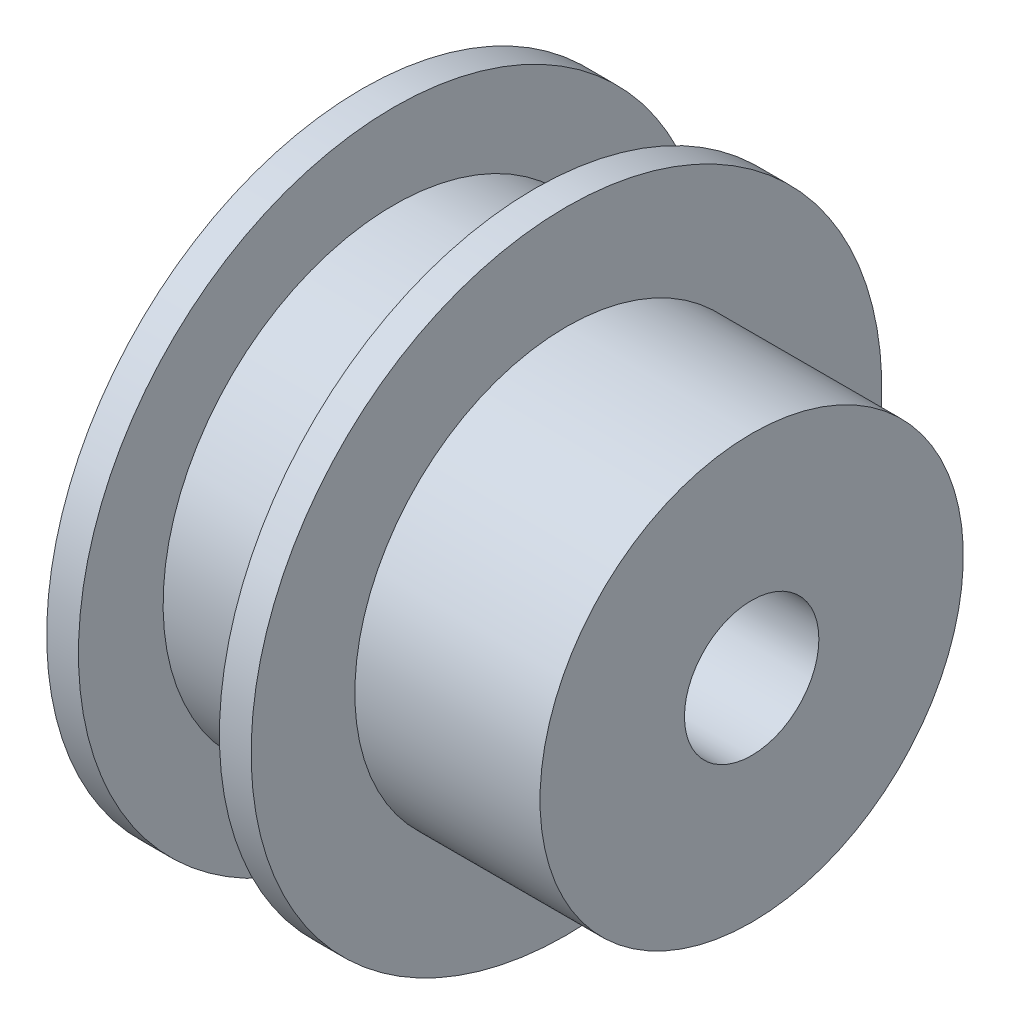
ISO-10303-21;
HEADER;
FILE_DESCRIPTION(('STEP AP214'),'2;1');
FILE_NAME('part.step','',(''),(''),'','','');
FILE_SCHEMA(('AUTOMOTIVE_DESIGN { 1 0 10303 214 1 1 1 1 }'));
ENDSEC;
DATA;
#1=APPLICATION_CONTEXT('core data for automotive mechanical design processes');
#2=APPLICATION_PROTOCOL_DEFINITION('international standard','automotive_design',2000,#1);
#3=PRODUCT_CONTEXT('',#1,'mechanical');
#4=PRODUCT('Part','Part','',(#3));
#5=PRODUCT_RELATED_PRODUCT_CATEGORY('part','',(#4));
#6=PRODUCT_DEFINITION_FORMATION('','',#4);
#7=PRODUCT_DEFINITION_CONTEXT('part definition',#1,'design');
#8=PRODUCT_DEFINITION('design','',#6,#7);
#9=PRODUCT_DEFINITION_SHAPE('','',#8);
#10=(LENGTH_UNIT() NAMED_UNIT(*) SI_UNIT(.MILLI.,.METRE.));
#11=(NAMED_UNIT(*) PLANE_ANGLE_UNIT() SI_UNIT($,.RADIAN.));
#12=(NAMED_UNIT(*) SI_UNIT($,.STERADIAN.) SOLID_ANGLE_UNIT());
#13=UNCERTAINTY_MEASURE_WITH_UNIT(LENGTH_MEASURE(1.E-05),#10,'distance_accuracy_value','');
#14=(GEOMETRIC_REPRESENTATION_CONTEXT(3) GLOBAL_UNCERTAINTY_ASSIGNED_CONTEXT((#13)) GLOBAL_UNIT_ASSIGNED_CONTEXT((#10,
#11,#12)) REPRESENTATION_CONTEXT('',''));
#15=CARTESIAN_POINT('',(0.,0.,0.));
#16=DIRECTION('',(0.,0.,1.));
#17=DIRECTION('',(1.,0.,0.));
#18=AXIS2_PLACEMENT_3D('',#15,#16,#17);
#19=CARTESIAN_POINT('',(-4.83,-10.9,0.));
#20=DIRECTION('',(-1.,0.,0.));
#21=DIRECTION('',(0.,-1.,0.));
#22=AXIS2_PLACEMENT_3D('',#19,#20,#21);
#23=CYLINDRICAL_SURFACE('',#22,14.9);
#24=CARTESIAN_POINT('',(3.33,-10.9,0.));
#25=DIRECTION('',(-1.,0.,0.));
#26=DIRECTION('',(0.,-1.,0.));
#27=AXIS2_PLACEMENT_3D('',#24,#25,#26);
#28=CIRCLE('',#27,14.9);
#29=CARTESIAN_POINT('',(3.33,-25.8,0.));
#30=VERTEX_POINT('',#29);
#31=EDGE_CURVE('E10',#30,#30,#28,.T.);
#32=ORIENTED_EDGE('',*,*,#31,.F.);
#33=EDGE_LOOP('',(#32));
#34=FACE_BOUND('',#33,.T.);
#35=CARTESIAN_POINT('',(4.83,-10.9,0.));
#36=DIRECTION('',(-1.,0.,0.));
#37=DIRECTION('',(0.,-1.,0.));
#38=AXIS2_PLACEMENT_3D('',#35,#36,#37);
#39=CIRCLE('',#38,14.9);
#40=CARTESIAN_POINT('',(4.83,-25.8,0.));
#41=VERTEX_POINT('',#40);
#42=EDGE_CURVE('E72',#41,#41,#39,.T.);
#43=ORIENTED_EDGE('',*,*,#42,.T.);
#44=EDGE_LOOP('',(#43));
#45=FACE_BOUND('',#44,.T.);
#46=ADVANCED_FACE('F37',(#34,#45),#23,.T.);
#47=CARTESIAN_POINT('',(3.33,4.,0.));
#48=DIRECTION('',(1.,0.,0.));
#49=DIRECTION('',(0.,1.,0.));
#50=AXIS2_PLACEMENT_3D('',#47,#48,#49);
#51=PLANE('',#50);
#52=CARTESIAN_POINT('',(3.33,-10.9,0.));
#53=DIRECTION('',(-1.,0.,0.));
#54=DIRECTION('',(0.,-1.,0.));
#55=AXIS2_PLACEMENT_3D('',#52,#53,#54);
#56=CIRCLE('',#55,10.9);
#57=CARTESIAN_POINT('',(3.33,-21.8,0.));
#58=VERTEX_POINT('',#57);
#59=EDGE_CURVE('E45',#58,#58,#56,.T.);
#60=ORIENTED_EDGE('',*,*,#59,.F.);
#61=EDGE_LOOP('',(#60));
#62=FACE_BOUND('',#61,.T.);
#63=ORIENTED_EDGE('',*,*,#31,.T.);
#64=EDGE_LOOP('',(#63));
#65=FACE_BOUND('',#64,.T.);
#66=ADVANCED_FACE('F100',(#62,#65),#51,.F.);
#67=CARTESIAN_POINT('',(-4.83,-10.9,0.));
#68=DIRECTION('',(-1.,0.,0.));
#69=DIRECTION('',(0.,-1.,0.));
#70=AXIS2_PLACEMENT_3D('',#67,#68,#69);
#71=CYLINDRICAL_SURFACE('',#70,10.9);
#72=CARTESIAN_POINT('',(-3.33,-10.9,0.));
#73=DIRECTION('',(-1.,0.,0.));
#74=DIRECTION('',(0.,-1.,0.));
#75=AXIS2_PLACEMENT_3D('',#72,#73,#74);
#76=CIRCLE('',#75,10.9);
#77=CARTESIAN_POINT('',(-3.33,-21.8,0.));
#78=VERTEX_POINT('',#77);
#79=EDGE_CURVE('E50',#78,#78,#76,.T.);
#80=ORIENTED_EDGE('',*,*,#79,.F.);
#81=EDGE_LOOP('',(#80));
#82=FACE_BOUND('',#81,.T.);
#83=ORIENTED_EDGE('',*,*,#59,.T.);
#84=EDGE_LOOP('',(#83));
#85=FACE_BOUND('',#84,.T.);
#86=ADVANCED_FACE('F105',(#82,#85),#71,.T.);
#87=CARTESIAN_POINT('',(-3.33,0.,0.));
#88=DIRECTION('',(-1.,0.,0.));
#89=DIRECTION('',(0.,-1.,0.));
#90=AXIS2_PLACEMENT_3D('',#87,#88,#89);
#91=PLANE('',#90);
#92=CARTESIAN_POINT('',(-3.33,-10.9,0.));
#93=DIRECTION('',(-1.,0.,0.));
#94=DIRECTION('',(0.,-1.,0.));
#95=AXIS2_PLACEMENT_3D('',#92,#93,#94);
#96=CIRCLE('',#95,14.9);
#97=CARTESIAN_POINT('',(-3.33,-25.8,0.));
#98=VERTEX_POINT('',#97);
#99=EDGE_CURVE('E56',#98,#98,#96,.T.);
#100=ORIENTED_EDGE('',*,*,#99,.F.);
#101=EDGE_LOOP('',(#100));
#102=FACE_BOUND('',#101,.T.);
#103=ORIENTED_EDGE('',*,*,#79,.T.);
#104=EDGE_LOOP('',(#103));
#105=FACE_BOUND('',#104,.T.);
#106=ADVANCED_FACE('F127',(#102,#105),#91,.F.);
#107=CARTESIAN_POINT('',(-4.83,-10.9,0.));
#108=DIRECTION('',(-1.,0.,0.));
#109=DIRECTION('',(0.,-1.,0.));
#110=AXIS2_PLACEMENT_3D('',#107,#108,#109);
#111=CYLINDRICAL_SURFACE('',#110,14.9);
#112=CARTESIAN_POINT('',(-4.83,-10.9,0.));
#113=DIRECTION('',(-1.,0.,0.));
#114=DIRECTION('',(0.,-1.,0.));
#115=AXIS2_PLACEMENT_3D('',#112,#113,#114);
#116=CIRCLE('',#115,14.9);
#117=CARTESIAN_POINT('',(-4.83,-25.8,0.));
#118=VERTEX_POINT('',#117);
#119=EDGE_CURVE('E60',#118,#118,#116,.T.);
#120=ORIENTED_EDGE('',*,*,#119,.F.);
#121=EDGE_LOOP('',(#120));
#122=FACE_BOUND('',#121,.T.);
#123=ORIENTED_EDGE('',*,*,#99,.T.);
#124=EDGE_LOOP('',(#123));
#125=FACE_BOUND('',#124,.T.);
#126=ADVANCED_FACE('F122',(#122,#125),#111,.T.);
#127=CARTESIAN_POINT('',(-4.83,4.,0.));
#128=DIRECTION('',(1.,0.,0.));
#129=DIRECTION('',(0.,1.,0.));
#130=AXIS2_PLACEMENT_3D('',#127,#128,#129);
#131=PLANE('',#130);
#132=CARTESIAN_POINT('',(-4.83,-10.9,0.));
#133=DIRECTION('',(1.,0.,0.));
#134=DIRECTION('',(0.,1.,0.));
#135=AXIS2_PLACEMENT_3D('',#132,#133,#134);
#136=CIRCLE('',#135,3.175);
#137=CARTESIAN_POINT('',(-4.83,-7.725,0.));
#138=VERTEX_POINT('',#137);
#139=EDGE_CURVE('E76',#138,#138,#136,.T.);
#140=ORIENTED_EDGE('',*,*,#139,.T.);
#141=EDGE_LOOP('',(#140));
#142=FACE_BOUND('',#141,.T.);
#143=ORIENTED_EDGE('',*,*,#119,.T.);
#144=EDGE_LOOP('',(#143));
#145=FACE_BOUND('',#144,.T.);
#146=ADVANCED_FACE('F117',(#142,#145),#131,.F.);
#147=CARTESIAN_POINT('',(13.58,-10.9,0.));
#148=DIRECTION('',(-1.,0.,0.));
#149=DIRECTION('',(0.,-1.,0.));
#150=AXIS2_PLACEMENT_3D('',#147,#148,#149);
#151=PLANE('',#150);
#152=CARTESIAN_POINT('',(13.58,-10.9,0.));
#153=DIRECTION('',(-1.,0.,0.));
#154=DIRECTION('',(0.,-1.,0.));
#155=AXIS2_PLACEMENT_3D('',#152,#153,#154);
#156=CIRCLE('',#155,3.175);
#157=CARTESIAN_POINT('',(13.58,-14.075,0.));
#158=VERTEX_POINT('',#157);
#159=EDGE_CURVE('E40',#158,#158,#156,.T.);
#160=ORIENTED_EDGE('',*,*,#159,.T.);
#161=EDGE_LOOP('',(#160));
#162=FACE_BOUND('',#161,.T.);
#163=CARTESIAN_POINT('',(13.58,-10.9,0.));
#164=DIRECTION('',(-1.,0.,0.));
#165=DIRECTION('',(0.,-1.,0.));
#166=AXIS2_PLACEMENT_3D('',#163,#164,#165);
#167=CIRCLE('',#166,9.999999939);
#168=CARTESIAN_POINT('',(13.58,-20.899999939,0.));
#169=VERTEX_POINT('',#168);
#170=EDGE_CURVE('E64',#169,#169,#167,.T.);
#171=ORIENTED_EDGE('',*,*,#170,.F.);
#172=EDGE_LOOP('',(#171));
#173=FACE_BOUND('',#172,.T.);
#174=ADVANCED_FACE('F85',(#162,#173),#151,.F.);
#175=CARTESIAN_POINT('',(-4.83,-10.9,0.));
#176=DIRECTION('',(-1.,0.,0.));
#177=DIRECTION('',(0.,-1.,0.));
#178=AXIS2_PLACEMENT_3D('',#175,#176,#177);
#179=CYLINDRICAL_SURFACE('',#178,9.99999993899999);
#180=CARTESIAN_POINT('',(4.83,-10.9,0.));
#181=DIRECTION('',(-1.,0.,0.));
#182=DIRECTION('',(0.,-1.,0.));
#183=AXIS2_PLACEMENT_3D('',#180,#181,#182);
#184=CIRCLE('',#183,9.99999993899999);
#185=CARTESIAN_POINT('',(4.83,-20.899999939,0.));
#186=VERTEX_POINT('',#185);
#187=EDGE_CURVE('E68',#186,#186,#184,.T.);
#188=ORIENTED_EDGE('',*,*,#187,.F.);
#189=EDGE_LOOP('',(#188));
#190=FACE_BOUND('',#189,.T.);
#191=ORIENTED_EDGE('',*,*,#170,.T.);
#192=EDGE_LOOP('',(#191));
#193=FACE_BOUND('',#192,.T.);
#194=ADVANCED_FACE('F96',(#190,#193),#179,.T.);
#195=CARTESIAN_POINT('',(4.83,-0.900000061000003,0.));
#196=DIRECTION('',(-1.,0.,0.));
#197=DIRECTION('',(0.,-1.,0.));
#198=AXIS2_PLACEMENT_3D('',#195,#196,#197);
#199=PLANE('',#198);
#200=ORIENTED_EDGE('',*,*,#42,.F.);
#201=EDGE_LOOP('',(#200));
#202=FACE_BOUND('',#201,.T.);
#203=ORIENTED_EDGE('',*,*,#187,.T.);
#204=EDGE_LOOP('',(#203));
#205=FACE_BOUND('',#204,.T.);
#206=ADVANCED_FACE('F90',(#202,#205),#199,.F.);
#207=CARTESIAN_POINT('',(-4.83,-10.9,0.));
#208=DIRECTION('',(1.,0.,0.));
#209=DIRECTION('',(0.,1.,0.));
#210=AXIS2_PLACEMENT_3D('',#207,#208,#209);
#211=CYLINDRICAL_SURFACE('',#210,3.175);
#212=ORIENTED_EDGE('',*,*,#139,.F.);
#213=EDGE_LOOP('',(#212));
#214=FACE_BOUND('',#213,.T.);
#215=ORIENTED_EDGE('',*,*,#159,.F.);
#216=EDGE_LOOP('',(#215));
#217=FACE_BOUND('',#216,.T.);
#218=ADVANCED_FACE('F88',(#214,#217),#211,.F.);
#219=CLOSED_SHELL('',(#46,#66,#86,#106,#126,#146,#174,#194,#206,#218));
#220=MANIFOLD_SOLID_BREP('B2',#219);
#221=ADVANCED_BREP_SHAPE_REPRESENTATION('',(#18,#220),#14);
#222=SHAPE_DEFINITION_REPRESENTATION(#9,#221);
ENDSEC;
END-ISO-10303-21;
